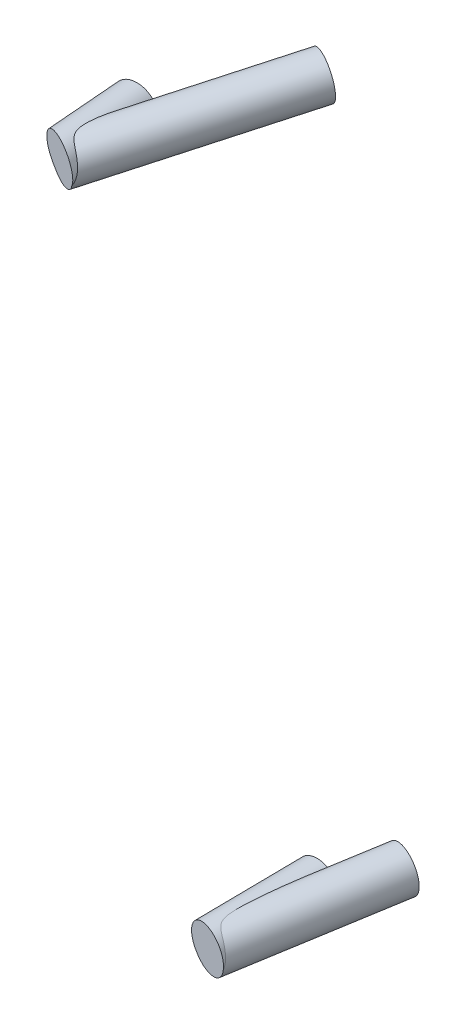
ISO-10303-21;
HEADER;
FILE_DESCRIPTION(('STEP AP214'),'2;1');
FILE_NAME('part.step','',(''),(''),'','','');
FILE_SCHEMA(('AUTOMOTIVE_DESIGN { 1 0 10303 214 1 1 1 1 }'));
ENDSEC;
DATA;
#1=APPLICATION_CONTEXT('core data for automotive mechanical design processes');
#2=APPLICATION_PROTOCOL_DEFINITION('international standard','automotive_design',2000,#1);
#3=PRODUCT_CONTEXT('',#1,'mechanical');
#4=PRODUCT('Part','Part','',(#3));
#5=PRODUCT_RELATED_PRODUCT_CATEGORY('part','',(#4));
#6=PRODUCT_DEFINITION_FORMATION('','',#4);
#7=PRODUCT_DEFINITION_CONTEXT('part definition',#1,'design');
#8=PRODUCT_DEFINITION('design','',#6,#7);
#9=PRODUCT_DEFINITION_SHAPE('','',#8);
#10=(LENGTH_UNIT() NAMED_UNIT(*) SI_UNIT(.MILLI.,.METRE.));
#11=(NAMED_UNIT(*) PLANE_ANGLE_UNIT() SI_UNIT($,.RADIAN.));
#12=(NAMED_UNIT(*) SI_UNIT($,.STERADIAN.) SOLID_ANGLE_UNIT());
#13=UNCERTAINTY_MEASURE_WITH_UNIT(LENGTH_MEASURE(1.E-05),#10,'distance_accuracy_value','');
#14=(GEOMETRIC_REPRESENTATION_CONTEXT(3) GLOBAL_UNCERTAINTY_ASSIGNED_CONTEXT((#13)) GLOBAL_UNIT_ASSIGNED_CONTEXT((#10,
#11,#12)) REPRESENTATION_CONTEXT('',''));
#15=CARTESIAN_POINT('',(0.,0.,0.));
#16=DIRECTION('',(0.,0.,1.));
#17=DIRECTION('',(1.,0.,0.));
#18=AXIS2_PLACEMENT_3D('',#15,#16,#17);
#19=CARTESIAN_POINT('',(320.463788,904.215779,-269.727885));
#20=DIRECTION('',(0.249324729269208,0.0769130284527394,-0.965360847263377));
#21=DIRECTION('',(-0.968228929450566,0.,-0.250065471776914));
#22=AXIS2_PLACEMENT_3D('',#19,#20,#21);
#23=PLANE('',#22);
#24=CARTESIAN_POINT('',(320.463788,904.215779,-269.727885));
#25=DIRECTION('',(0.249324729269208,0.0769130284527394,-0.965360847263377));
#26=DIRECTION('',(-0.968228929450566,0.,-0.250065471776914));
#27=AXIS2_PLACEMENT_3D('',#24,#25,#26);
#28=CIRCLE('',#27,7.00000000000002);
#29=CARTESIAN_POINT('',(327.0395366218,902.385691318126,-268.175367966422));
#30=VERTEX_POINT('',#29);
#31=CARTESIAN_POINT('',(315.167305258131,899.96891509523,-271.434172648507));
#32=VERTEX_POINT('',#31);
#33=EDGE_CURVE('E105',#30,#32,#28,.T.);
#34=ORIENTED_EDGE('',*,*,#33,.F.);
#35=CARTESIAN_POINT('',(320.39314699671,904.551347994074,-269.719393793223));
#36=DIRECTION('',(0.249324729269208,0.0769130284527394,-0.965360847263377));
#37=DIRECTION('',(-0.946270958503707,-0.192628087752839,-0.259741588701465));
#38=AXIS2_PLACEMENT_3D('',#35,#36,#37);
#39=ELLIPSE('',#38,7.20898734497029,6.99999999999999);
#40=EDGE_CURVE('E112',#30,#32,#39,.F.);
#41=ORIENTED_EDGE('',*,*,#40,.T.);
#42=EDGE_LOOP('',(#34,#41));
#43=FACE_BOUND('',#42,.T.);
#44=ADVANCED_FACE('F77',(#43),#23,.F.);
#45=CARTESIAN_POINT('',(333.563058,908.256712,-320.446971));
#46=DIRECTION('',(0.249324729269208,0.0769130284527394,-0.965360847263377));
#47=DIRECTION('',(-0.968228929450566,0.,-0.250065471776914));
#48=AXIS2_PLACEMENT_3D('',#45,#46,#47);
#49=PLANE('',#48);
#50=CARTESIAN_POINT('',(333.563058,908.256712,-320.446971));
#51=DIRECTION('',(0.249324729269208,0.0769130284527394,-0.965360847263377));
#52=DIRECTION('',(-0.968228929450566,0.,-0.250065471776914));
#53=AXIS2_PLACEMENT_3D('',#50,#51,#52);
#54=CIRCLE('',#53,7.00000000000002);
#55=CARTESIAN_POINT('',(326.785455493846,908.256712,-322.197429302438));
#56=VERTEX_POINT('',#55);
#57=EDGE_CURVE('E111',#56,#56,#54,.T.);
#58=ORIENTED_EDGE('',*,*,#57,.T.);
#59=EDGE_LOOP('',(#58));
#60=FACE_BOUND('',#59,.T.);
#61=ADVANCED_FACE('F139',(#60),#49,.T.);
#62=CARTESIAN_POINT('',(320.463788,904.215779,-269.727885));
#63=DIRECTION('',(0.249324729269209,0.0769130284527309,-0.965360847263377));
#64=DIRECTION('',(-0.968228929450566,0.,-0.250065471776915));
#65=AXIS2_PLACEMENT_3D('',#62,#63,#64);
#66=CYLINDRICAL_SURFACE('',#65,7.00000000000002);
#67=CARTESIAN_POINT('',(327.039536621798,902.385691318119,-268.175367966423));
#68=CARTESIAN_POINT('',(327.100858753756,902.577557080961,-268.208738048315));
#69=CARTESIAN_POINT('',(327.153977565183,902.772232986631,-268.24096154995));
#70=CARTESIAN_POINT('',(327.243440287666,903.165585814106,-268.304158064311));
#71=CARTESIAN_POINT('',(327.279785502868,903.364262423603,-268.335131174083));
#72=CARTESIAN_POINT('',(327.335316267917,903.763839518529,-268.396845372397));
#73=CARTESIAN_POINT('',(327.354517943102,903.964737733804,-268.42758665195));
#74=CARTESIAN_POINT('',(327.375692708085,904.367340178859,-268.489694848334));
#75=CARTESIAN_POINT('',(327.377666092852,904.569044394781,-268.521061754445));
#76=CARTESIAN_POINT('',(327.364411858995,904.971812126756,-268.58517635072));
#77=CARTESIAN_POINT('',(327.349172193677,905.172875095214,-268.617924992454));
#78=CARTESIAN_POINT('',(327.301677156962,905.572639312864,-268.68543603302));
#79=CARTESIAN_POINT('',(327.269421793729,905.771340563189,-268.720198430885));
#80=CARTESIAN_POINT('',(327.188282301356,906.164756906194,-268.792333191042));
#81=CARTESIAN_POINT('',(327.139404294652,906.359473438566,-268.829704588367));
#82=CARTESIAN_POINT('',(327.025558354444,906.74348188841,-268.907660460046));
#83=CARTESIAN_POINT('',(326.960590583093,906.932773860529,-268.948244902016));
#84=CARTESIAN_POINT('',(326.815466515573,907.303993903117,-269.03312229594));
#85=CARTESIAN_POINT('',(326.735349807626,907.485939699851,-269.077405417521));
#86=CARTESIAN_POINT('',(326.560706752392,907.841595385547,-269.170414757999));
#87=CARTESIAN_POINT('',(326.466180302071,908.015305215609,-269.219141008666));
#88=CARTESIAN_POINT('',(326.263735818006,908.35327789682,-269.321793531596));
#89=CARTESIAN_POINT('',(326.155809460102,908.517534782056,-269.375723031487));
#90=CARTESIAN_POINT('',(325.927914562679,908.835248741628,-269.489607856918));
#91=CARTESIAN_POINT('',(325.807946240198,908.988706010528,-269.549563073852));
#92=CARTESIAN_POINT('',(325.557340534629,909.283907661565,-269.676626427207));
#93=CARTESIAN_POINT('',(325.426687601734,909.425634346098,-269.743745033755));
#94=CARTESIAN_POINT('',(325.156746008993,909.69610932296,-269.886352167456));
#95=CARTESIAN_POINT('',(325.017456363934,909.824856130221,-269.961841650276));
#96=CARTESIAN_POINT('',(324.732703613507,910.068365919285,-270.122706018981));
#97=CARTESIAN_POINT('',(324.587245219812,910.183139323506,-270.208073443298));
#98=CARTESIAN_POINT('',(324.29301010766,910.398066460518,-270.390639066932));
#99=CARTESIAN_POINT('',(324.144234658964,910.498225680463,-270.487832800584));
#100=CARTESIAN_POINT('',(323.88901389787,910.657354164741,-270.666805636004));
#101=CARTESIAN_POINT('',(323.782461359547,910.719974430089,-270.745203705332));
#102=CARTESIAN_POINT('',(323.571258912894,910.837406575692,-270.909985623154));
#103=CARTESIAN_POINT('',(323.466608489491,910.892220598131,-270.99636727003));
#104=CARTESIAN_POINT('',(323.261325519971,910.994025170114,-271.17755223374));
#105=CARTESIAN_POINT('',(323.160684014156,911.041034007407,-271.272335042961));
#106=CARTESIAN_POINT('',(322.965157578484,911.127673844592,-271.470816619232));
#107=CARTESIAN_POINT('',(322.870272439223,911.167305112973,-271.574515061619));
#108=CARTESIAN_POINT('',(322.687626742023,911.239920282675,-271.791293448408));
#109=CARTESIAN_POINT('',(322.599910392788,911.272864560363,-271.904424012761));
#110=CARTESIAN_POINT('',(322.433704397671,911.332594215039,-272.138854925205));
#111=CARTESIAN_POINT('',(322.355218094175,911.359377364293,-272.260158207943));
#112=CARTESIAN_POINT('',(322.208319412598,911.407720446805,-272.509752488527));
#113=CARTESIAN_POINT('',(322.139911190814,911.429278227422,-272.638046339639));
#114=CARTESIAN_POINT('',(322.01329472964,911.468147257023,-272.90013406586));
#115=CARTESIAN_POINT('',(321.955085846894,911.485458773882,-273.033927593403));
#116=CARTESIAN_POINT('',(321.823127998411,911.524181684504,-273.36980024431));
#117=CARTESIAN_POINT('',(321.755007705299,911.543672862987,-273.574309611909));
#118=CARTESIAN_POINT('',(321.636602161923,911.577951244129,-273.988784693994));
#119=CARTESIAN_POINT('',(321.586329561645,911.592735109601,-274.198754165784));
#120=CARTESIAN_POINT('',(321.499914156484,911.619334879109,-274.62300248063));
#121=CARTESIAN_POINT('',(321.463857080754,911.631132626623,-274.837299515875));
#122=CARTESIAN_POINT('',(321.418390682047,911.647324035488,-275.159934342221));
#123=CARTESIAN_POINT('',(321.404673042315,911.652469700453,-275.267662639522));
#124=CARTESIAN_POINT('',(321.379787044649,911.662349241479,-275.483429759411));
#125=CARTESIAN_POINT('',(321.368618594208,911.667083132479,-275.591468570586));
#126=CARTESIAN_POINT('',(321.335620554966,911.682090294075,-275.946729617453));
#127=CARTESIAN_POINT('',(321.318530734154,911.691665790777,-276.194423772877));
#128=CARTESIAN_POINT('',(321.293271316441,911.709699210462,-276.690324006251));
#129=CARTESIAN_POINT('',(321.285103950769,911.71815685344,-276.938530196706));
#130=CARTESIAN_POINT('',(321.275663730724,911.734298108452,-277.435283239166));
#131=CARTESIAN_POINT('',(321.274396317731,911.741981104907,-277.683830205464));
#132=CARTESIAN_POINT('',(321.277290058799,911.756763206365,-278.180915775048));
#133=CARTESIAN_POINT('',(321.281451589482,911.763862270823,-278.429454376558));
#134=CARTESIAN_POINT('',(321.300389818183,911.784503488811,-279.176288474701));
#135=CARTESIAN_POINT('',(321.321632625601,911.797346827199,-279.674435369522));
#136=CARTESIAN_POINT('',(321.375409380221,911.821579080339,-280.669872478002));
#137=CARTESIAN_POINT('',(321.407938152855,911.832968658366,-281.167162979483));
#138=CARTESIAN_POINT('',(321.481093600792,911.854444338757,-282.163703806062));
#139=CARTESIAN_POINT('',(321.521760492634,911.864523540402,-282.662951286122));
#140=CARTESIAN_POINT('',(321.608901293641,911.883303855543,-283.661012280062));
#141=CARTESIAN_POINT('',(321.655375842269,911.892004817045,-284.159825740053));
#142=CARTESIAN_POINT('',(321.752620879771,911.907961325653,-285.156193077103));
#143=CARTESIAN_POINT('',(321.803383889631,911.915219318042,-285.653747649762));
#144=CARTESIAN_POINT('',(321.908311584583,911.928240649165,-286.648518445585));
#145=CARTESIAN_POINT('',(321.962476289942,911.934003978993,-287.145734666716));
#146=CARTESIAN_POINT('',(322.09920553348,911.946264526375,-288.369832464509));
#147=CARTESIAN_POINT('',(322.183316338923,911.951867828115,-289.096550231503));
#148=CARTESIAN_POINT('',(322.355914520054,911.959469448462,-290.549492062428));
#149=CARTESIAN_POINT('',(322.444401956828,911.961467716736,-291.275716119325));
#150=CARTESIAN_POINT('',(322.62490972494,911.961594198357,-292.728189360574));
#151=CARTESIAN_POINT('',(322.71693224576,911.959719974044,-293.454438272811));
#152=CARTESIAN_POINT('',(322.903854305968,911.95180662687,-294.906542745683));
#153=CARTESIAN_POINT('',(322.998753844697,911.945767504962,-295.632398306409));
#154=CARTESIAN_POINT('',(323.1896098402,911.929321111753,-297.073039121025));
#155=CARTESIAN_POINT('',(323.285530123886,911.918979510203,-297.787829911912));
#156=CARTESIAN_POINT('',(323.479513663628,911.893576680945,-299.217035899785));
#157=CARTESIAN_POINT('',(323.577576915764,911.878515461869,-299.931451097456));
#158=CARTESIAN_POINT('',(323.775610340386,911.843268874745,-301.359410069783));
#159=CARTESIAN_POINT('',(323.875579207826,911.8230869047,-302.072954108245));
#160=CARTESIAN_POINT('',(324.077404026504,911.777061905897,-303.499598382057));
#161=CARTESIAN_POINT('',(324.179259994479,911.75121882691,-304.212698613413));
#162=CARTESIAN_POINT('',(324.282017233499,911.722279346477,-304.925547804236));
#163=B_SPLINE_CURVE_WITH_KNOTS('',3,(#67,#68,#69,#70,#71,#72,#73,#74,#75,#76,#77,#78,#79,#80,
#81,#82,#83,#84,#85,#86,#87,#88,#89,#90,#91,#92,#93,#94,#95,#96,#97,#98,#99,#100,#101,#102,#103,
#104,#105,#106,#107,#108,#109,#110,#111,#112,#113,#114,#115,#116,#117,#118,#119,#120,#121,#122,
#123,#124,#125,#126,#127,#128,#129,#130,#131,#132,#133,#134,#135,#136,#137,#138,#139,#140,#141,
#142,#143,#144,#145,#146,#147,#148,#149,#150,#151,#152,#153,#154,#155,#156,#157,#158,#159,#160,
#161,#162),.UNSPECIFIED.,.F.,.F.,(4,2,2,2,2,2,2,2,2,2,2,2,2,2,2,2,2,2,2,2,2,2,2,2,2,2,2,2,2,2,2,
2,2,2,2,2,2,2,2,2,2,2,2,2,2,2,2,4),(0.,0.612319459669294,1.22459130347429,1.83628663134027,
2.44797148626098,3.06008469921152,3.67219761840692,4.28408532850359,4.89596687220362,
5.50627096851343,6.11657942889662,6.72726893407711,7.33794743442815,7.9495310638715,
8.56118458722161,9.17237906130977,9.7833434578289,10.2220356789238,10.6606072815186,
11.0981363380471,11.5356494686766,11.9756839022784,12.4158771937062,12.8562515199431,
13.2965980582192,13.9447388119223,14.5933380383214,15.2457910173741,15.5719280560698,
15.8980532579899,16.6432078782753,17.3885487960421,18.1344774128266,18.8804577795644,
20.3765187661648,21.8718947196387,23.3748515213292,24.8779739551469,26.3785270418137,
27.8790890698671,30.0738329026971,32.2686073770117,34.4647638400519,36.6609197997706,
38.8247183697181,40.9885129817483,43.1508754921539,45.3132571899508),.UNSPECIFIED.);
#164=CARTESIAN_POINT('',(324.282017233501,911.722279346479,-304.925547804235));
#165=VERTEX_POINT('',#164);
#166=EDGE_CURVE('E13',#30,#165,#163,.T.);
#167=ORIENTED_EDGE('',*,*,#166,.F.);
#168=ORIENTED_EDGE('',*,*,#33,.T.);
#169=CARTESIAN_POINT('',(326.117200818741,900.837113418913,-305.20824440563));
#170=CARTESIAN_POINT('',(326.045158467571,900.752058336233,-304.635641619287));
#171=CARTESIAN_POINT('',(325.972469262156,900.669014141468,-304.06282370761));
#172=CARTESIAN_POINT('',(325.825774344906,900.506658676429,-302.916830883639));
#173=CARTESIAN_POINT('',(325.751768641147,900.427347383264,-302.343655973556));
#174=CARTESIAN_POINT('',(325.60241733412,900.272168133074,-301.19701758823));
#175=CARTESIAN_POINT('',(325.527071736019,900.196300162775,-300.623554114108));
#176=CARTESIAN_POINT('',(325.374976862785,900.047772903349,-299.476397672253));
#177=CARTESIAN_POINT('',(325.298227585279,899.975113619649,-298.902704704133));
#178=CARTESIAN_POINT('',(325.065624319391,899.761520625661,-297.180482216824));
#179=CARTESIAN_POINT('',(324.907529875579,899.625090830283,-296.03169396664));
#180=CARTESIAN_POINT('',(324.58410608799,899.36285247326,-293.73393076689));
#181=CARTESIAN_POINT('',(324.418776790674,899.237043843422,-292.584955818571));
#182=CARTESIAN_POINT('',(324.162781022397,899.055014082216,-290.857664547956));
#183=CARTESIAN_POINT('',(324.075787953178,898.995248582598,-290.279174878649));
#184=CARTESIAN_POINT('',(323.89873818317,898.877997861426,-289.122430527751));
#185=CARTESIAN_POINT('',(323.808681476813,898.820512644016,-288.544175846588));
#186=CARTESIAN_POINT('',(323.624765195978,898.707721584418,-287.388286108425));
#187=CARTESIAN_POINT('',(323.530907087142,898.652414918204,-286.810650899119));
#188=CARTESIAN_POINT('',(323.338214293706,898.543846132432,-285.656021839889));
#189=CARTESIAN_POINT('',(323.239379683294,898.490583982417,-285.079027980537));
#190=CARTESIAN_POINT('',(323.068203004324,898.403026384565,-284.113615155862));
#191=CARTESIAN_POINT('',(322.997703238324,898.368197954022,-283.724918418447));
#192=CARTESIAN_POINT('',(322.852813090919,898.299419615266,-282.94817444955));
#193=CARTESIAN_POINT('',(322.778422758952,898.265469695896,-282.560127209879));
#194=CARTESIAN_POINT('',(322.624560394969,898.198430799062,-281.784598153918));
#195=CARTESIAN_POINT('',(322.545083878857,898.165342618509,-281.397117153387));
#196=CARTESIAN_POINT('',(322.379491959943,898.100126767524,-280.623514591006));
#197=CARTESIAN_POINT('',(322.293377086006,898.067999020858,-280.237392923418));
#198=CARTESIAN_POINT('',(322.123857290732,898.008989297195,-279.517264257569));
#199=CARTESIAN_POINT('',(322.041556767449,897.981968542392,-279.183011122276));
#200=CARTESIAN_POINT('',(321.867656866395,897.929060450955,-278.516719021398));
#201=CARTESIAN_POINT('',(321.776054816648,897.903173443077,-278.184680721409));
#202=CARTESIAN_POINT('',(321.580063800061,897.853105174808,-277.524294232678));
#203=CARTESIAN_POINT('',(321.475679221598,897.828923333484,-277.195944819532));
#204=CARTESIAN_POINT('',(321.305449059097,897.794879028307,-276.708099868404));
#205=CARTESIAN_POINT('',(321.246444393553,897.783904473999,-276.546299318051));
#206=CARTESIAN_POINT('',(321.122938318164,897.762983422265,-276.224752225797));
#207=CARTESIAN_POINT('',(321.058437684833,897.753036780045,-276.065005397389));
#208=CARTESIAN_POINT('',(320.922712454929,897.734549541664,-275.747916916109));
#209=CARTESIAN_POINT('',(320.851474899433,897.726011745758,-275.590580604062));
#210=CARTESIAN_POINT('',(320.701117540559,897.710959157818,-275.279643920199));
#211=CARTESIAN_POINT('',(320.622000140342,897.704443751483,-275.126042427025));
#212=CARTESIAN_POINT('',(320.454633871383,897.694290841517,-274.824144502872));
#213=CARTESIAN_POINT('',(320.366403194634,897.690647725133,-274.675838268839));
#214=CARTESIAN_POINT('',(320.179366660624,897.68739110749,-274.385977932851));
#215=CARTESIAN_POINT('',(320.080563931375,897.687776417563,-274.244421851512));
#216=CARTESIAN_POINT('',(319.891414106963,897.693501657953,-273.996298311421));
#217=CARTESIAN_POINT('',(319.803045286148,897.69788313918,-273.888204896375));
#218=CARTESIAN_POINT('',(319.618693355733,897.711235353828,-273.678954096128));
#219=CARTESIAN_POINT('',(319.522709286416,897.720206666463,-273.577797588161));
#220=CARTESIAN_POINT('',(319.323682675006,897.743702259387,-273.383588230809));
#221=CARTESIAN_POINT('',(319.220648053573,897.758220389742,-273.290526546226));
#222=CARTESIAN_POINT('',(319.008440780025,897.793697177357,-273.113101132906));
#223=CARTESIAN_POINT('',(318.899270250172,897.814653618825,-273.028734425048));
#224=CARTESIAN_POINT('',(318.676251795876,897.863692652719,-272.868914924499));
#225=CARTESIAN_POINT('',(318.562407472614,897.891769841841,-272.793455436251));
#226=CARTESIAN_POINT('',(318.331576845962,897.955515170678,-272.651051371212));
#227=CARTESIAN_POINT('',(318.214590411611,897.991183627223,-272.584107150001));
#228=CARTESIAN_POINT('',(317.978801508376,898.070426497513,-272.457860051518));
#229=CARTESIAN_POINT('',(317.859995302206,898.114020005909,-272.398576234657));
#230=CARTESIAN_POINT('',(317.622297522106,898.209084292528,-272.286874944744));
#231=CARTESIAN_POINT('',(317.503405934662,898.260556922625,-272.234459091299));
#232=CARTESIAN_POINT('',(317.22743711269,898.389700171556,-272.118987112372));
#233=CARTESIAN_POINT('',(317.070818993064,898.470388712537,-272.05819488762));
#234=CARTESIAN_POINT('',(316.762126688584,898.645066625229,-271.944625632218));
#235=CARTESIAN_POINT('',(316.610054320969,898.73906123236,-271.89185177351));
#236=CARTESIAN_POINT('',(316.31250903759,898.939566405173,-271.792332474751));
#237=CARTESIAN_POINT('',(316.167031650447,899.046068309567,-271.745582909388));
#238=CARTESIAN_POINT('',(315.884151007296,899.270801356487,-271.656401227676));
#239=CARTESIAN_POINT('',(315.746743658404,899.389026470107,-271.61396691463));
#240=CARTESIAN_POINT('',(315.536133908086,899.585186136178,-271.548982589635));
#241=CARTESIAN_POINT('',(315.459881997732,899.659560603541,-271.525467477801));
#242=CARTESIAN_POINT('',(315.310931151299,899.811704781623,-271.479268610976));
#243=CARTESIAN_POINT('',(315.238224927032,899.889466846738,-271.456583176866));
#244=CARTESIAN_POINT('',(315.167305258134,899.968915095227,-271.434172648507));
#245=B_SPLINE_CURVE_WITH_KNOTS('',3,(#169,#170,#171,#172,#173,#174,#175,#176,#177,#178,#179,
#180,#181,#182,#183,#184,#185,#186,#187,#188,#189,#190,#191,#192,#193,#194,#195,#196,#197,#198,
#199,#200,#201,#202,#203,#204,#205,#206,#207,#208,#209,#210,#211,#212,#213,#214,#215,#216,#217,
#218,#219,#220,#221,#222,#223,#224,#225,#226,#227,#228,#229,#230,#231,#232,#233,#234,#235,#236,
#237,#238,#239,#240,#241,#242,#243,#244),.UNSPECIFIED.,.F.,.F.,(4,2,2,2,2,2,2,2,2,2,2,2,2,2,2,2,
2,2,2,2,2,2,2,2,2,2,2,2,2,2,2,2,2,2,2,2,2,4),(0.,1.7500460306372,3.5000813286751,
5.25010987962805,7.0001413913354,10.502904842494,14.0056458025712,15.7697534959849,
17.5338643957584,19.2973014937939,21.0607123109595,22.2504091530404,23.4400908809463,
24.6308363073318,25.8214869673324,26.8572713584014,27.8933541375225,28.9290822104867,
29.4467218447729,29.9642884637674,30.4828717320649,31.0012973265416,31.5187073352236,
32.0359646760668,32.454622548514,32.8733332666817,33.2915810878705,33.7096851269515,
34.1274728483065,34.545278009913,34.9641035061469,35.3830275929223,35.9413630742792,
36.499918852675,37.05809008774,37.6159757457513,37.9431190529756,38.2695588228393),.UNSPECIFIED.);
#246=CARTESIAN_POINT('',(326.117200818741,900.837113418913,-305.20824440563));
#247=VERTEX_POINT('',#246);
#248=EDGE_CURVE('E100',#247,#32,#245,.T.);
#249=ORIENTED_EDGE('',*,*,#248,.F.);
#250=CARTESIAN_POINT('',(329.567373473229,907.024101826928,-304.976073221562));
#251=DIRECTION('',(0.0159019479525123,0.028637862758801,-0.999463356440807));
#252=DIRECTION('',(0.978436853140769,0.205428982749971,0.02145361187077));
#253=AXIS2_PLACEMENT_3D('',#250,#251,#252);
#254=ELLIPSE('',#253,7.20898734497032,7.00000000000002);
#255=EDGE_CURVE('E90',#165,#247,#254,.F.);
#256=ORIENTED_EDGE('',*,*,#255,.F.);
#257=EDGE_LOOP('',(#167,#168,#249,#256));
#258=FACE_BOUND('',#257,.T.);
#259=ORIENTED_EDGE('',*,*,#57,.F.);
#260=EDGE_LOOP('',(#259));
#261=FACE_BOUND('',#260,.T.);
#262=ADVANCED_FACE('F106',(#258,#261),#66,.T.);
#263=CARTESIAN_POINT('',(320.956941999995,905.566688000004,-305.154828999993));
#264=DIRECTION('',(0.0159019479525123,0.028637862758801,-0.999463356440807));
#265=DIRECTION('',(0.,0.999589748535364,0.0286414843017364));
#266=AXIS2_PLACEMENT_3D('',#263,#264,#265);
#267=PLANE('',#266);
#268=CARTESIAN_POINT('',(320.956941999995,905.566688000004,-305.154828999993));
#269=DIRECTION('',(0.0159019479525123,0.028637862758801,-0.999463356440807));
#270=DIRECTION('',(0.,0.999589748535364,0.0286414843017364));
#271=AXIS2_PLACEMENT_3D('',#268,#269,#270);
#272=CIRCLE('',#271,6.99999999999999);
#273=EDGE_CURVE('E118',#247,#165,#272,.T.);
#274=ORIENTED_EDGE('',*,*,#273,.T.);
#275=ORIENTED_EDGE('',*,*,#255,.T.);
#276=EDGE_LOOP('',(#274,#275));
#277=FACE_BOUND('',#276,.T.);
#278=ADVANCED_FACE('F132',(#277),#267,.T.);
#279=CARTESIAN_POINT('',(320.349360315772,904.472492437315,-266.967329503517));
#280=DIRECTION('',(0.0159019479525111,0.028637862758805,-0.999463356440807));
#281=DIRECTION('',(0.,0.999589748535364,0.0286414843017405));
#282=AXIS2_PLACEMENT_3D('',#279,#280,#281);
#283=CYLINDRICAL_SURFACE('',#282,6.99999999999999);
#284=ORIENTED_EDGE('',*,*,#40,.F.);
#285=ORIENTED_EDGE('',*,*,#166,.T.);
#286=ORIENTED_EDGE('',*,*,#273,.F.);
#287=ORIENTED_EDGE('',*,*,#248,.T.);
#288=EDGE_LOOP('',(#284,#285,#286,#287));
#289=FACE_BOUND('',#288,.T.);
#290=ADVANCED_FACE('F116',(#289),#283,.T.);
#291=CLOSED_SHELL('',(#44,#61,#262,#278,#290));
#292=MANIFOLD_SOLID_BREP('B2',#291);
#293=CARTESIAN_POINT('',(277.571086,1107.97074,-264.572092));
#294=DIRECTION('',(0.390137444194902,0.105274304464949,-0.91471858812232));
#295=DIRECTION('',(-0.919829879002764,0.,-0.392317465445729));
#296=AXIS2_PLACEMENT_3D('',#293,#294,#295);
#297=PLANE('',#296);
#298=CARTESIAN_POINT('',(277.571086,1107.97074,-264.572092));
#299=DIRECTION('',(0.390137444194902,0.105274304464949,-0.91471858812232));
#300=DIRECTION('',(-0.919829879002764,0.,-0.392317465445729));
#301=AXIS2_PLACEMENT_3D('',#298,#299,#300);
#302=CIRCLE('',#301,7.00000000000002);
#303=CARTESIAN_POINT('',(283.481344196764,1104.91032170962,-262.403523823641));
#304=VERTEX_POINT('',#303);
#305=CARTESIAN_POINT('',(273.373081867948,1102.89737243227,-266.946476726613));
#306=VERTEX_POINT('',#305);
#307=EDGE_CURVE('E227',#304,#306,#302,.T.);
#308=ORIENTED_EDGE('',*,*,#307,.F.);
#309=CARTESIAN_POINT('',(277.415675970742,1108.70899000418,-264.553411408705));
#310=DIRECTION('',(0.390137444194902,0.105274304464949,-0.91471858812232));
#311=DIRECTION('',(-0.897432033983248,-0.178713687578272,-0.403332570285201));
#312=AXIS2_PLACEMENT_3D('',#309,#310,#311);
#313=ELLIPSE('',#312,7.90464373989975,6.99999999999999);
#314=EDGE_CURVE('E234',#304,#306,#313,.F.);
#315=ORIENTED_EDGE('',*,*,#314,.T.);
#316=EDGE_LOOP('',(#308,#315));
#317=FACE_BOUND('',#316,.T.);
#318=ADVANCED_FACE('F199',(#317),#297,.F.);
#319=CARTESIAN_POINT('',(303.246728,1114.89903,-324.771356));
#320=DIRECTION('',(0.390137444194902,0.105274304464949,-0.91471858812232));
#321=DIRECTION('',(-0.919829879002764,0.,-0.392317465445729));
#322=AXIS2_PLACEMENT_3D('',#319,#320,#321);
#323=PLANE('',#322);
#324=CARTESIAN_POINT('',(303.246728,1114.89903,-324.771356));
#325=DIRECTION('',(0.390137444194902,0.105274304464949,-0.91471858812232));
#326=DIRECTION('',(-0.919829879002764,0.,-0.392317465445729));
#327=AXIS2_PLACEMENT_3D('',#324,#325,#326);
#328=CIRCLE('',#327,7.00000000000002);
#329=CARTESIAN_POINT('',(296.807918846981,1114.89903,-327.51757825812));
#330=VERTEX_POINT('',#329);
#331=EDGE_CURVE('E233',#330,#330,#328,.T.);
#332=ORIENTED_EDGE('',*,*,#331,.T.);
#333=EDGE_LOOP('',(#332));
#334=FACE_BOUND('',#333,.T.);
#335=ADVANCED_FACE('F261',(#334),#323,.T.);
#336=CARTESIAN_POINT('',(277.571086,1107.97074,-264.572092));
#337=DIRECTION('',(0.390137444194901,0.105274304464949,-0.91471858812232));
#338=DIRECTION('',(-0.919829879002764,0.,-0.392317465445728));
#339=AXIS2_PLACEMENT_3D('',#336,#337,#338);
#340=CYLINDRICAL_SURFACE('',#339,7.00000000000002);
#341=CARTESIAN_POINT('',(283.481344196764,1104.91032170962,-262.403523823641));
#342=CARTESIAN_POINT('',(283.533167528917,1104.993921177,-262.426773464536));
#343=CARTESIAN_POINT('',(283.583351968389,1105.0787631528,-262.449141256356));
#344=CARTESIAN_POINT('',(283.680284161101,1105.25075244691,-262.492378039455));
#345=CARTESIAN_POINT('',(283.72703217039,1105.33789959281,-262.5132471424));
#346=CARTESIAN_POINT('',(283.861856103453,1105.60247300196,-262.573991388175));
#347=CARTESIAN_POINT('',(283.94455643679,1105.78310290097,-262.612022860289));
#348=CARTESIAN_POINT('',(284.094481261907,1106.15109190918,-262.684864233139));
#349=CARTESIAN_POINT('',(284.161718147978,1106.33844548898,-262.719676700501));
#350=CARTESIAN_POINT('',(284.280078006289,1106.71849445538,-262.787547999102));
#351=CARTESIAN_POINT('',(284.331200740497,1106.91118992085,-262.82060680443));
#352=CARTESIAN_POINT('',(284.416819458084,1107.3004095036,-262.886161787361));
#353=CARTESIAN_POINT('',(284.451309276096,1107.49693501252,-262.918657752037));
#354=CARTESIAN_POINT('',(284.503311822173,1107.89215115086,-262.984066011407));
#355=CARTESIAN_POINT('',(284.520824687018,1108.09084176283,-263.016978302744));
#356=CARTESIAN_POINT('',(284.538737316066,1108.48869058971,-263.084050993832));
#357=CARTESIAN_POINT('',(284.53914487607,1108.68784855025,-263.118210817911));
#358=CARTESIAN_POINT('',(284.522923090073,1109.08511356857,-263.188531560961));
#359=CARTESIAN_POINT('',(284.506293923472,1109.28322063741,-263.224692458858));
#360=CARTESIAN_POINT('',(284.456346048865,1109.67598773578,-263.29952630302));
#361=CARTESIAN_POINT('',(284.423095744928,1109.87065853515,-263.338188392518));
#362=CARTESIAN_POINT('',(284.340368379324,1110.25583464395,-263.418765412317));
#363=CARTESIAN_POINT('',(284.290891301114,1110.44633994913,-263.460680345932));
#364=CARTESIAN_POINT('',(284.176314182949,1110.82172517135,-263.548360899941));
#365=CARTESIAN_POINT('',(284.111210987989,1111.00660394385,-263.594127296754));
#366=CARTESIAN_POINT('',(283.96619203057,1111.36926171297,-263.690099876287));
#367=CARTESIAN_POINT('',(283.886276298376,1111.5470407241,-263.740306049934));
#368=CARTESIAN_POINT('',(283.712890020194,1111.89362818607,-263.845634654773));
#369=CARTESIAN_POINT('',(283.619460513867,1112.0624617547,-263.900742013219));
#370=CARTESIAN_POINT('',(283.420062011096,1112.39047675534,-264.016698948694));
#371=CARTESIAN_POINT('',(283.314092950376,1112.54965813787,-264.077548555156));
#372=CARTESIAN_POINT('',(283.090952428191,1112.85732790464,-264.205842979531));
#373=CARTESIAN_POINT('',(282.973773279022,1113.00580882654,-264.273292324175));
#374=CARTESIAN_POINT('',(282.729950640607,1113.29092023915,-264.415716164898));
#375=CARTESIAN_POINT('',(282.603307223321,1113.42755081995,-264.490690603763));
#376=CARTESIAN_POINT('',(282.341323232529,1113.68927602014,-264.650076180156));
#377=CARTESIAN_POINT('',(282.205912201691,1113.81425036479,-264.734569263572));
#378=CARTESIAN_POINT('',(281.929929601455,1114.05042435826,-264.913865968941));
#379=CARTESIAN_POINT('',(281.789357331066,1114.16162212694,-265.008670994902));
#380=CARTESIAN_POINT('',(281.506355793761,1114.3694264754,-265.210067560646));
#381=CARTESIAN_POINT('',(281.363930210947,1114.46605827253,-265.316638163802));
#382=CARTESIAN_POINT('',(281.080729924901,1114.64456197224,-265.543431916023));
#383=CARTESIAN_POINT('',(280.939954456444,1114.72644099175,-265.663648436267));
#384=CARTESIAN_POINT('',(280.703228452703,1114.85451059986,-265.883234180557));
#385=CARTESIAN_POINT('',(280.60580695485,1114.9042616533,-265.978956724564));
#386=CARTESIAN_POINT('',(280.415881246321,1114.99634754818,-266.178487811659));
#387=CARTESIAN_POINT('',(280.323375671114,1115.03868445515,-266.282294090982));
#388=CARTESIAN_POINT('',(280.145173045761,1115.11623221654,-266.497736630151));
#389=CARTESIAN_POINT('',(280.059463127272,1115.15145674475,-266.609357298989));
#390=CARTESIAN_POINT('',(279.896121816111,1115.21543759496,-266.840116747796));
#391=CARTESIAN_POINT('',(279.818490567373,1115.24419380174,-266.959255661652));
#392=CARTESIAN_POINT('',(279.672444331534,1115.29591186703,-267.203924749681));
#393=CARTESIAN_POINT('',(279.604012394216,1115.31888445232,-267.329442565327));
#394=CARTESIAN_POINT('',(279.476589581971,1115.35992700806,-267.585934702718));
#395=CARTESIAN_POINT('',(279.417599127386,1115.37799676024,-267.716909267076));
#396=CARTESIAN_POINT('',(279.308809110281,1115.41008864474,-267.983312794212));
#397=CARTESIAN_POINT('',(279.259023893699,1115.42410447806,-268.118748328642));
#398=CARTESIAN_POINT('',(279.168160343621,1115.44881690224,-268.392776605075));
#399=CARTESIAN_POINT('',(279.127082171917,1115.45951343142,-268.531369405693));
#400=CARTESIAN_POINT('',(279.045544603192,1115.48006994465,-268.838069643868));
#401=CARTESIAN_POINT('',(279.006769649619,1115.48935952967,-269.006659811432));
#402=CARTESIAN_POINT('',(278.938870026918,1115.50501401678,-269.345937208384));
#403=CARTESIAN_POINT('',(278.909749534533,1115.51137765349,-269.516625312358));
#404=CARTESIAN_POINT('',(278.85962769731,1115.52182263483,-269.859503970532));
#405=CARTESIAN_POINT('',(278.838638967165,1115.52590043783,-270.031696438713));
#406=CARTESIAN_POINT('',(278.80350767572,1115.53221553231,-270.376816662049));
#407=CARTESIAN_POINT('',(278.789366035618,1115.53445257618,-270.549744512987));
#408=CARTESIAN_POINT('',(278.766711469686,1115.5374158144,-270.897456468197));
#409=CARTESIAN_POINT('',(278.758247770154,1115.53812890977,-271.072243789389));
#410=CARTESIAN_POINT('',(278.746194951587,1115.53822973817,-271.421981841912));
#411=CARTESIAN_POINT('',(278.742605934609,1115.53761744345,-271.596932576586));
#412=CARTESIAN_POINT('',(278.739531631618,1115.53522111099,-271.946694922109));
#413=CARTESIAN_POINT('',(278.740042556764,1115.53343815648,-272.121506512138));
#414=CARTESIAN_POINT('',(278.744536198682,1115.52880331329,-272.471064837262));
#415=CARTESIAN_POINT('',(278.748518885118,1115.52595143394,-272.645811572911));
#416=CARTESIAN_POINT('',(278.761781530279,1115.5178113885,-273.070027249782));
#417=CARTESIAN_POINT('',(278.77259987603,1115.51200291263,-273.319437936307));
#418=CARTESIAN_POINT('',(278.799118312672,1115.49845566122,-273.817950380648));
#419=CARTESIAN_POINT('',(278.814818676872,1115.49071677762,-274.067052120384));
#420=CARTESIAN_POINT('',(278.867895081338,1115.46467766676,-274.81393110262));
#421=CARTESIAN_POINT('',(278.911242767106,1115.44355683291,-275.311188057418));
#422=CARTESIAN_POINT('',(279.009152658091,1115.39368406287,-276.304611629665));
#423=CARTESIAN_POINT('',(279.063724692442,1115.36492543179,-276.800776903612));
#424=CARTESIAN_POINT('',(279.18125536382,1115.2993117379,-277.791587632501));
#425=CARTESIAN_POINT('',(279.244214247434,1115.262456437,-278.286233042318));
#426=CARTESIAN_POINT('',(279.37617885357,1115.18026584702,-279.269928835953));
#427=CARTESIAN_POINT('',(279.445131854246,1115.13500116504,-279.758992217234));
#428=CARTESIAN_POINT('',(279.588382739905,1115.03485363334,-280.735373965437));
#429=CARTESIAN_POINT('',(279.662680841441,1114.97997039379,-281.222692260818));
#430=CARTESIAN_POINT('',(279.815881452368,1114.85934165489,-282.195241877079));
#431=CARTESIAN_POINT('',(279.894783771619,1114.79359660389,-282.680473283255));
#432=CARTESIAN_POINT('',(280.056740148811,1114.64958929145,-283.648383985087));
#433=CARTESIAN_POINT('',(280.139794029544,1114.57132756398,-284.131063388706));
#434=CARTESIAN_POINT('',(280.277568732925,1114.43248192362,-284.910613895083));
#435=CARTESIAN_POINT('',(280.33108586133,1114.37645412021,-285.208511475381));
#436=CARTESIAN_POINT('',(280.439608847933,1114.25795150971,-285.80273333705));
#437=CARTESIAN_POINT('',(280.494614592459,1114.19547719385,-286.099057736496));
#438=CARTESIAN_POINT('',(280.606040580206,1114.06325519908,-286.689340011499));
#439=CARTESIAN_POINT('',(280.66245858874,1113.99351851964,-286.983300759971));
#440=CARTESIAN_POINT('',(280.776836167113,1113.84547738184,-287.568847675599));
#441=CARTESIAN_POINT('',(280.834796094796,1113.76717092125,-287.860433270662));
#442=CARTESIAN_POINT('',(280.952849549473,1113.59962576686,-288.443055280539));
#443=CARTESIAN_POINT('',(281.012957834226,1113.51029281816,-288.734061771939));
#444=CARTESIAN_POINT('',(281.134859088246,1113.31905001877,-289.311417938404));
#445=CARTESIAN_POINT('',(281.19665096689,1113.21714816599,-289.597770444953));
#446=CARTESIAN_POINT('',(281.290868958889,1113.05204442103,-290.02306229187));
#447=CARTESIAN_POINT('',(281.322612276047,1112.99480749775,-290.164472547829));
#448=CARTESIAN_POINT('',(281.386574153303,1112.87570579136,-290.445198776714));
#449=CARTESIAN_POINT('',(281.418792624939,1112.81384186114,-290.58451512996));
#450=CARTESIAN_POINT('',(281.483792244744,1112.68463704091,-290.860849038371));
#451=CARTESIAN_POINT('',(281.516574435437,1112.61728488562,-290.997861131507));
#452=CARTESIAN_POINT('',(281.582656742023,1112.47618418752,-291.268527772538));
#453=CARTESIAN_POINT('',(281.615957174433,1112.40243159886,-291.402180126813));
#454=CARTESIAN_POINT('',(281.649506636967,1112.32500430266,-291.533686050557));
#455=B_SPLINE_CURVE_WITH_KNOTS('',3,(#341,#342,#343,#344,#345,#346,#347,#348,#349,#350,#351,
#352,#353,#354,#355,#356,#357,#358,#359,#360,#361,#362,#363,#364,#365,#366,#367,#368,#369,#370,
#371,#372,#373,#374,#375,#376,#377,#378,#379,#380,#381,#382,#383,#384,#385,#386,#387,#388,#389,
#390,#391,#392,#393,#394,#395,#396,#397,#398,#399,#400,#401,#402,#403,#404,#405,#406,#407,#408,
#409,#410,#411,#412,#413,#414,#415,#416,#417,#418,#419,#420,#421,#422,#423,#424,#425,#426,#427,
#428,#429,#430,#431,#432,#433,#434,#435,#436,#437,#438,#439,#440,#441,#442,#443,#444,#445,#446,
#447,#448,#449,#450,#451,#452,#453,#454),.UNSPECIFIED.,.F.,.F.,(4,2,2,2,2,2,2,2,2,2,2,2,2,2,2,2,
2,2,2,2,2,2,2,2,2,2,2,2,2,2,2,2,2,2,2,2,2,2,2,2,2,2,2,2,2,2,2,2,2,2,2,2,2,2,2,2,4),(0.,
0.303155157359221,0.606287703576057,1.21229399704081,1.81781285710364,2.42334066129234,
3.02909274588422,3.63483994995359,4.24031107967769,4.8457758337351,5.44876907080189,
6.05176292262108,6.65487862497756,7.25799309503169,7.85931300784933,8.46063600307322,
9.06237437337264,9.66410816887676,10.2714881932821,10.8789510183811,11.4853497866936,
12.0914552333391,12.5270848738917,12.9625929566992,13.3972556164451,13.8319260190321,
14.2657842076243,14.69966170657,15.1342097868451,15.5687659410776,16.0881071482269,
16.6076727421786,17.1280411345634,17.6484795171343,18.1733735875414,18.6982786471091,
19.2226986870386,19.7471141446799,20.4961792572038,21.2452863119246,22.7437826645729,
24.2435968768059,25.7434551955356,27.2312471112375,28.7190993376779,30.2068901640582,
31.6946175384039,32.617981840489,33.5412758317842,34.4631912104362,35.3853224440636,
36.3159670408462,37.2460224697847,37.7134220003154,38.1807355845389,38.6490337941108,
39.1176302127695),.UNSPECIFIED.);
#456=CARTESIAN_POINT('',(281.64950663697,1112.32500430266,-291.533686050557));
#457=VERTEX_POINT('',#456);
#458=EDGE_CURVE('E75',#304,#457,#455,.T.);
#459=ORIENTED_EDGE('',*,*,#458,.F.);
#460=ORIENTED_EDGE('',*,*,#307,.T.);
#461=CARTESIAN_POINT('',(282.351701872769,1107.57316310222,-291.63258508166));
#462=CARTESIAN_POINT('',(282.345159235222,1107.51066232283,-291.546683457444));
#463=CARTESIAN_POINT('',(282.338160112935,1107.44971629238,-291.459709589045));
#464=CARTESIAN_POINT('',(282.323351066052,1107.33064432644,-291.283949478123));
#465=CARTESIAN_POINT('',(282.315541347584,1107.2725176795,-291.195163700942));
#466=CARTESIAN_POINT('',(282.291061810167,1107.10200997939,-290.926714265312));
#467=CARTESIAN_POINT('',(282.273326992442,1106.99336703364,-290.744770978094));
#468=CARTESIAN_POINT('',(282.235638375598,1106.78463271496,-290.377091611044));
#469=CARTESIAN_POINT('',(282.215691819517,1106.68451522194,-290.191369447751));
#470=CARTESIAN_POINT('',(282.173902713835,1106.49110730241,-289.816553387634));
#471=CARTESIAN_POINT('',(282.152059570548,1106.39781903061,-289.62745844986));
#472=CARTESIAN_POINT('',(282.106850965225,1106.21749801403,-289.247500017994));
#473=CARTESIAN_POINT('',(282.083492391333,1106.13044029235,-289.05664750276));
#474=CARTESIAN_POINT('',(282.035367338791,1105.96140185669,-288.672919234275));
#475=CARTESIAN_POINT('',(282.010601021724,1105.87942056227,-288.480043715293));
#476=CARTESIAN_POINT('',(281.93435952169,1105.63997003604,-287.898521308528));
#477=CARTESIAN_POINT('',(281.880988656281,1105.4891757765,-287.507368620006));
#478=CARTESIAN_POINT('',(281.769222683137,1105.1998761931,-286.715127478048));
#479=CARTESIAN_POINT('',(281.710768687049,1105.06156786882,-286.313976336365));
#480=CARTESIAN_POINT('',(281.589903564628,1104.79709530448,-285.508254788891));
#481=CARTESIAN_POINT('',(281.527492050557,1104.67093225741,-285.103684051443));
#482=CARTESIAN_POINT('',(281.398920290802,1104.42897018283,-284.292077676253));
#483=CARTESIAN_POINT('',(281.332760163972,1104.31317082702,-283.885042117027));
#484=CARTESIAN_POINT('',(281.196705359632,1104.09059996769,-283.069157175914));
#485=CARTESIAN_POINT('',(281.126810827867,1103.98382811227,-282.660307865382));
#486=CARTESIAN_POINT('',(280.983037190937,1103.77815540298,-281.840769298504));
#487=CARTESIAN_POINT('',(280.909153133827,1103.67926472663,-281.43007836396));
#488=CARTESIAN_POINT('',(280.757139816869,1103.48870569686,-280.607801701312));
#489=CARTESIAN_POINT('',(280.67901047543,1103.39703748234,-280.196215956156));
#490=CARTESIAN_POINT('',(280.517959235892,1103.22031915487,-279.372658497002));
#491=CARTESIAN_POINT('',(280.435038372245,1103.13526762267,-278.960686885064));
#492=CARTESIAN_POINT('',(280.263528302884,1102.97127935906,-278.136718583503));
#493=CARTESIAN_POINT('',(280.174939306976,1102.89234240156,-277.724721895372));
#494=CARTESIAN_POINT('',(280.00525346409,1102.75218917394,-276.96594582901));
#495=CARTESIAN_POINT('',(279.925167824169,1102.69013781107,-276.619094777629));
#496=CARTESIAN_POINT('',(279.758886588479,1102.57000566034,-275.92613973102));
#497=CARTESIAN_POINT('',(279.672690656721,1102.51192509116,-275.580035777954));
#498=CARTESIAN_POINT('',(279.491960080256,1102.39935687285,-274.88689057816));
#499=CARTESIAN_POINT('',(279.397373724533,1102.34489572784,-274.53985843992));
#500=CARTESIAN_POINT('',(279.197960851113,1102.24017554889,-273.848142169592));
#501=CARTESIAN_POINT('',(279.09313658654,1102.18991559487,-273.503457538656));
#502=CARTESIAN_POINT('',(278.924444782429,1102.11765700766,-272.986206515904));
#503=CARTESIAN_POINT('',(278.865730501714,1102.09389602006,-272.812205169728));
#504=CARTESIAN_POINT('',(278.744022665654,1102.04775294815,-272.465526215823));
#505=CARTESIAN_POINT('',(278.68102940784,1102.02537076818,-272.292848516983));
#506=CARTESIAN_POINT('',(278.549863057738,1101.98215695037,-271.948953053434));
#507=CARTESIAN_POINT('',(278.481682062742,1101.96132777788,-271.777737976616));
#508=CARTESIAN_POINT('',(278.339252484685,1101.92157532899,-271.437640177187));
#509=CARTESIAN_POINT('',(278.265004857211,1101.90265175348,-271.268757092133));
#510=CARTESIAN_POINT('',(278.110207558663,1101.86738926405,-270.936136908176));
#511=CARTESIAN_POINT('',(278.029746057874,1101.85102157255,-270.77236213534));
#512=CARTESIAN_POINT('',(277.860417380854,1101.82125105828,-270.448862400736));
#513=CARTESIAN_POINT('',(277.771548697247,1101.80784876863,-270.289138171751));
#514=CARTESIAN_POINT('',(277.584283638382,1101.78498864864,-269.97565850608));
#515=CARTESIAN_POINT('',(277.485915598944,1101.7755195082,-269.821887124204));
#516=CARTESIAN_POINT('',(277.278201375133,1101.76176324598,-269.521767993551));
#517=CARTESIAN_POINT('',(277.1688627364,1101.75747258852,-269.375415245075));
#518=CARTESIAN_POINT('',(276.951804523112,1101.75582526021,-269.108773898965));
#519=CARTESIAN_POINT('',(276.845385394244,1101.7577177478,-268.987436885166));
#520=CARTESIAN_POINT('',(276.623334949395,1101.76815413777,-268.753753139322));
#521=CARTESIAN_POINT('',(276.507703559954,1101.7766980932,-268.641406478982));
#522=CARTESIAN_POINT('',(276.26814855804,1101.80175825826,-268.427118187306));
#523=CARTESIAN_POINT('',(276.144233080829,1101.8182667427,-268.325166589127));
#524=CARTESIAN_POINT('',(275.889583610151,1101.86040343008,-268.132257749013));
#525=CARTESIAN_POINT('',(275.75884966556,1101.88603156766,-268.041300428286));
#526=CARTESIAN_POINT('',(275.492995277821,1101.94714711836,-267.870531402212));
#527=CARTESIAN_POINT('',(275.357886479093,1101.98260999856,-267.790692696242));
#528=CARTESIAN_POINT('',(275.085201894439,1102.06385847667,-267.641116500922));
#529=CARTESIAN_POINT('',(274.947625670925,1102.1096459226,-267.571380823616));
#530=CARTESIAN_POINT('',(274.671818825959,1102.21176160685,-267.44064053195));
#531=CARTESIAN_POINT('',(274.533587426464,1102.26811498279,-267.379657364713));
#532=CARTESIAN_POINT('',(274.258688852132,1102.39113361,-267.265201503094));
#533=CARTESIAN_POINT('',(274.122021201665,1102.45779563112,-267.211726466082));
#534=CARTESIAN_POINT('',(273.88211639852,1102.58504041701,-267.122165975428));
#535=CARTESIAN_POINT('',(273.778262158423,1102.64362821315,-267.084871709767));
#536=CARTESIAN_POINT('',(273.573476153984,1102.76635236032,-267.013486436803));
#537=CARTESIAN_POINT('',(273.472532922837,1102.83046125956,-266.979381160901));
#538=CARTESIAN_POINT('',(273.373081867948,1102.89737243227,-266.946476726613));
#539=B_SPLINE_CURVE_WITH_KNOTS('',3,(#461,#462,#463,#464,#465,#466,#467,#468,#469,#470,#471,
#472,#473,#474,#475,#476,#477,#478,#479,#480,#481,#482,#483,#484,#485,#486,#487,#488,#489,#490,
#491,#492,#493,#494,#495,#496,#497,#498,#499,#500,#501,#502,#503,#504,#505,#506,#507,#508,#509,
#510,#511,#512,#513,#514,#515,#516,#517,#518,#519,#520,#521,#522,#523,#524,#525,#526,#527,#528,
#529,#530,#531,#532,#533,#534,#535,#536,#537,#538),.UNSPECIFIED.,.F.,.F.,(4,2,2,2,2,2,2,2,2,2,2,
2,2,2,2,2,2,2,2,2,2,2,2,2,2,2,2,2,2,2,2,2,2,2,2,2,2,2,4),(0.,0.31925463525937,0.63842828505162,
1.27608365272073,1.91170927017499,2.54753457921408,3.18064879190925,3.81369048099526,
5.08107086523728,6.36584048958333,7.65073618413822,8.93559116182245,10.220396031206,
11.5068340441776,12.793296790047,14.079482828966,15.3656212871363,16.4495929444446,
17.5336242527506,18.624874977431,19.715886082256,20.271353833879,20.8267830015623,
21.3830759045729,21.9392813513238,22.4886850316739,23.0381874053546,23.586098513233,
24.1336353150051,24.6172672511546,25.1009030442426,25.5840706755884,26.0672348439469,
26.5492044280136,27.0312603497066,27.5144780384083,27.9975446204931,28.3721631771226,
28.7450161516514),.UNSPECIFIED.);
#540=CARTESIAN_POINT('',(282.351701872769,1107.57316310222,-291.63258508166));
#541=VERTEX_POINT('',#540);
#542=EDGE_CURVE('E222',#541,#306,#539,.T.);
#543=ORIENTED_EDGE('',*,*,#542,.F.);
#544=CARTESIAN_POINT('',(289.309556877988,1111.13823744366,-292.094181120121));
#545=DIRECTION('',(-0.0713991617640458,0.0102076867040669,-0.997395589939891));
#546=DIRECTION('',(0.975957806814222,0.207164341624132,-0.0677443346547488));
#547=AXIS2_PLACEMENT_3D('',#544,#545,#546);
#548=ELLIPSE('',#547,7.90464373989982,7.00000000000002);
#549=EDGE_CURVE('E212',#457,#541,#548,.F.);
#550=ORIENTED_EDGE('',*,*,#549,.F.);
#551=EDGE_LOOP('',(#459,#460,#543,#550));
#552=FACE_BOUND('',#551,.T.);
#553=ORIENTED_EDGE('',*,*,#331,.F.);
#554=EDGE_LOOP('',(#553));
#555=FACE_BOUND('',#554,.T.);
#556=ADVANCED_FACE('F228',(#552,#555),#340,.T.);
#557=CARTESIAN_POINT('',(275.513272,1108.98097,-291.128643999987));
#558=DIRECTION('',(-0.0713991617640458,0.0102076867040669,-0.997395589939891));
#559=DIRECTION('',(-0.997447556749249,0.,0.0714028818392749));
#560=AXIS2_PLACEMENT_3D('',#557,#558,#559);
#561=PLANE('',#560);
#562=CARTESIAN_POINT('',(275.513272,1108.98097,-291.128643999987));
#563=DIRECTION('',(-0.0713991617640458,0.0102076867040669,-0.997395589939891));
#564=DIRECTION('',(-0.997447556749249,0.,0.0714028818392749));
#565=AXIS2_PLACEMENT_3D('',#562,#563,#564);
#566=CIRCLE('',#565,6.99999999999999);
#567=EDGE_CURVE('E240',#541,#457,#566,.T.);
#568=ORIENTED_EDGE('',*,*,#567,.T.);
#569=ORIENTED_EDGE('',*,*,#549,.T.);
#570=EDGE_LOOP('',(#568,#569));
#571=FACE_BOUND('',#570,.T.);
#572=ADVANCED_FACE('F254',(#571),#561,.T.);
#573=CARTESIAN_POINT('',(277.760295291228,1108.65972099361,-259.739324212591));
#574=DIRECTION('',(-0.0713991617640385,0.010207686704076,-0.997395589939892));
#575=DIRECTION('',(-0.99744755674925,0.,0.0714028818392676));
#576=AXIS2_PLACEMENT_3D('',#573,#574,#575);
#577=CYLINDRICAL_SURFACE('',#576,6.99999999999999);
#578=ORIENTED_EDGE('',*,*,#314,.F.);
#579=ORIENTED_EDGE('',*,*,#458,.T.);
#580=ORIENTED_EDGE('',*,*,#567,.F.);
#581=ORIENTED_EDGE('',*,*,#542,.T.);
#582=EDGE_LOOP('',(#578,#579,#580,#581));
#583=FACE_BOUND('',#582,.T.);
#584=ADVANCED_FACE('F238',(#583),#577,.T.);
#585=CLOSED_SHELL('',(#318,#335,#556,#572,#584));
#586=MANIFOLD_SOLID_BREP('B7',#585);
#587=ADVANCED_BREP_SHAPE_REPRESENTATION('',(#18,#292,#586),#14);
#588=SHAPE_DEFINITION_REPRESENTATION(#9,#587);
ENDSEC;
END-ISO-10303-21;
